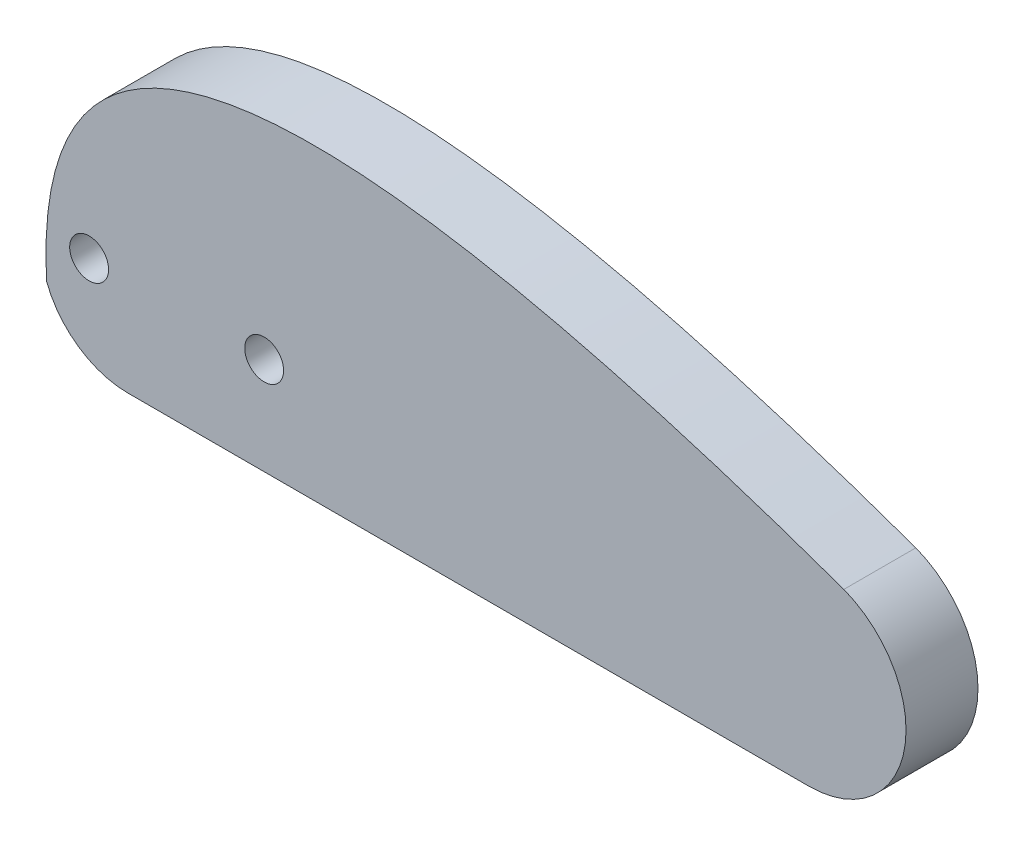
ISO-10303-21;
HEADER;
FILE_DESCRIPTION(('STEP AP214'),'2;1');
FILE_NAME('part.step','',(''),(''),'','','');
FILE_SCHEMA(('AUTOMOTIVE_DESIGN { 1 0 10303 214 1 1 1 1 }'));
ENDSEC;
DATA;
#1=APPLICATION_CONTEXT('core data for automotive mechanical design processes');
#2=APPLICATION_PROTOCOL_DEFINITION('international standard','automotive_design',2000,#1);
#3=PRODUCT_CONTEXT('',#1,'mechanical');
#4=PRODUCT('Part','Part','',(#3));
#5=PRODUCT_RELATED_PRODUCT_CATEGORY('part','',(#4));
#6=PRODUCT_DEFINITION_FORMATION('','',#4);
#7=PRODUCT_DEFINITION_CONTEXT('part definition',#1,'design');
#8=PRODUCT_DEFINITION('design','',#6,#7);
#9=PRODUCT_DEFINITION_SHAPE('','',#8);
#10=(LENGTH_UNIT() NAMED_UNIT(*) SI_UNIT(.MILLI.,.METRE.));
#11=(NAMED_UNIT(*) PLANE_ANGLE_UNIT() SI_UNIT($,.RADIAN.));
#12=(NAMED_UNIT(*) SI_UNIT($,.STERADIAN.) SOLID_ANGLE_UNIT());
#13=UNCERTAINTY_MEASURE_WITH_UNIT(LENGTH_MEASURE(1.E-05),#10,'distance_accuracy_value','');
#14=(GEOMETRIC_REPRESENTATION_CONTEXT(3) GLOBAL_UNCERTAINTY_ASSIGNED_CONTEXT((#13)) GLOBAL_UNIT_ASSIGNED_CONTEXT((#10,
#11,#12)) REPRESENTATION_CONTEXT('',''));
#15=CARTESIAN_POINT('',(0.,0.,0.));
#16=DIRECTION('',(0.,0.,1.));
#17=DIRECTION('',(1.,0.,0.));
#18=AXIS2_PLACEMENT_3D('',#15,#16,#17);
#19=CARTESIAN_POINT('',(0.,-0.516146655197097,3.7));
#20=DIRECTION('',(0.,0.,-1.));
#21=DIRECTION('',(-1.,0.,0.));
#22=AXIS2_PLACEMENT_3D('',#19,#20,#21);
#23=PLANE('',#22);
#24=CARTESIAN_POINT('',(0.,-0.516146655197097,3.7));
#25=DIRECTION('',(0.,0.,1.));
#26=DIRECTION('',(-1.,0.,0.));
#27=AXIS2_PLACEMENT_3D('',#24,#25,#26);
#28=CIRCLE('',#27,4.4838533448029);
#29=CARTESIAN_POINT('',(-4.18289775265634,-2.13117210655156,3.7));
#30=VERTEX_POINT('',#29);
#31=CARTESIAN_POINT('',(0.,-5.,3.7));
#32=VERTEX_POINT('',#31);
#33=EDGE_CURVE('E84',#30,#32,#28,.T.);
#34=ORIENTED_EDGE('',*,*,#33,.T.);
#35=DIRECTION('',(1.,0.,0.));
#36=VECTOR('',#35,1.);
#37=CARTESIAN_POINT('',(0.,-5.,3.7));
#38=LINE('',#37,#36);
#39=CARTESIAN_POINT('',(35.,-5.,3.7));
#40=VERTEX_POINT('',#39);
#41=EDGE_CURVE('E79',#32,#40,#38,.T.);
#42=ORIENTED_EDGE('',*,*,#41,.T.);
#43=CARTESIAN_POINT('',(35.,0.,3.7));
#44=DIRECTION('',(0.,0.,1.));
#45=DIRECTION('',(1.,0.,0.));
#46=AXIS2_PLACEMENT_3D('',#43,#44,#45);
#47=CIRCLE('',#46,5.);
#48=CARTESIAN_POINT('',(36.8028546482242,4.66365898382122,3.7));
#49=VERTEX_POINT('',#48);
#50=EDGE_CURVE('E82',#40,#49,#47,.T.);
#51=ORIENTED_EDGE('',*,*,#50,.T.);
#52=CARTESIAN_POINT('',(36.8028546482242,4.66365898382122,3.7));
#53=CARTESIAN_POINT('',(-5.42252809931158,19.7411868098003,3.7));
#54=CARTESIAN_POINT('',(-4.18289775265634,-2.13117210655156,3.7));
#55=B_SPLINE_CURVE_WITH_KNOTS('',2,(#52,#53,#54),.UNSPECIFIED.,.F.,.F.,(3,3),(0.,1.),.UNSPECIFIED.);
#56=EDGE_CURVE('E49',#49,#30,#55,.T.);
#57=ORIENTED_EDGE('',*,*,#56,.T.);
#58=EDGE_LOOP('',(#34,#42,#51,#57));
#59=FACE_BOUND('',#58,.T.);
#60=CARTESIAN_POINT('',(-2.,0.,3.7));
#61=DIRECTION('',(0.,0.,1.));
#62=DIRECTION('',(1.,0.,0.));
#63=AXIS2_PLACEMENT_3D('',#60,#61,#62);
#64=CIRCLE('',#63,1.);
#65=CARTESIAN_POINT('',(-1.,0.,3.7));
#66=VERTEX_POINT('',#65);
#67=EDGE_CURVE('E144',#66,#66,#64,.T.);
#68=ORIENTED_EDGE('',*,*,#67,.F.);
#69=EDGE_LOOP('',(#68));
#70=FACE_BOUND('',#69,.T.);
#71=CARTESIAN_POINT('',(7.,0.,3.7));
#72=DIRECTION('',(0.,0.,1.));
#73=DIRECTION('',(1.,0.,0.));
#74=AXIS2_PLACEMENT_3D('',#71,#72,#73);
#75=CIRCLE('',#74,1.);
#76=CARTESIAN_POINT('',(8.,0.,3.7));
#77=VERTEX_POINT('',#76);
#78=EDGE_CURVE('E135',#77,#77,#75,.T.);
#79=ORIENTED_EDGE('',*,*,#78,.F.);
#80=EDGE_LOOP('',(#79));
#81=FACE_BOUND('',#80,.T.);
#82=ADVANCED_FACE('F32',(#59,#70,#81),#23,.F.);
#83=CARTESIAN_POINT('',(0.,-0.516146655197097,0.));
#84=DIRECTION('',(0.,0.,-1.));
#85=DIRECTION('',(-1.,0.,0.));
#86=AXIS2_PLACEMENT_3D('',#83,#84,#85);
#87=PLANE('',#86);
#88=CARTESIAN_POINT('',(-2.,0.,0.));
#89=DIRECTION('',(0.,0.,1.));
#90=DIRECTION('',(1.,0.,0.));
#91=AXIS2_PLACEMENT_3D('',#88,#89,#90);
#92=CIRCLE('',#91,1.);
#93=CARTESIAN_POINT('',(-1.,0.,0.));
#94=VERTEX_POINT('',#93);
#95=EDGE_CURVE('E141',#94,#94,#92,.T.);
#96=ORIENTED_EDGE('',*,*,#95,.T.);
#97=EDGE_LOOP('',(#96));
#98=FACE_BOUND('',#97,.T.);
#99=CARTESIAN_POINT('',(0.,-0.516146655197097,0.));
#100=DIRECTION('',(0.,0.,1.));
#101=DIRECTION('',(-1.,0.,0.));
#102=AXIS2_PLACEMENT_3D('',#99,#100,#101);
#103=CIRCLE('',#102,4.4838533448029);
#104=CARTESIAN_POINT('',(-4.18289775265634,-2.13117210655156,0.));
#105=VERTEX_POINT('',#104);
#106=CARTESIAN_POINT('',(0.,-5.,0.));
#107=VERTEX_POINT('',#106);
#108=EDGE_CURVE('E99',#105,#107,#103,.T.);
#109=ORIENTED_EDGE('',*,*,#108,.F.);
#110=CARTESIAN_POINT('',(36.8028546482242,4.66365898382122,0.));
#111=CARTESIAN_POINT('',(-5.42252809931158,19.7411868098003,0.));
#112=CARTESIAN_POINT('',(-4.18289775265634,-2.13117210655156,0.));
#113=B_SPLINE_CURVE_WITH_KNOTS('',2,(#110,#111,#112),.UNSPECIFIED.,.F.,.F.,(3,3),(0.,1.),.UNSPECIFIED.);
#114=CARTESIAN_POINT('',(36.8028546482242,4.66365898382122,0.));
#115=VERTEX_POINT('',#114);
#116=EDGE_CURVE('E72',#115,#105,#113,.T.);
#117=ORIENTED_EDGE('',*,*,#116,.F.);
#118=CARTESIAN_POINT('',(35.,0.,0.));
#119=DIRECTION('',(0.,0.,1.));
#120=DIRECTION('',(1.,0.,0.));
#121=AXIS2_PLACEMENT_3D('',#118,#119,#120);
#122=CIRCLE('',#121,5.);
#123=CARTESIAN_POINT('',(35.,-5.,0.));
#124=VERTEX_POINT('',#123);
#125=EDGE_CURVE('E66',#124,#115,#122,.T.);
#126=ORIENTED_EDGE('',*,*,#125,.F.);
#127=DIRECTION('',(1.,0.,0.));
#128=VECTOR('',#127,1.);
#129=CARTESIAN_POINT('',(0.,-5.,0.));
#130=LINE('',#129,#128);
#131=EDGE_CURVE('E88',#107,#124,#130,.T.);
#132=ORIENTED_EDGE('',*,*,#131,.F.);
#133=EDGE_LOOP('',(#109,#117,#126,#132));
#134=FACE_BOUND('',#133,.T.);
#135=CARTESIAN_POINT('',(7.,0.,0.));
#136=DIRECTION('',(0.,0.,1.));
#137=DIRECTION('',(1.,0.,0.));
#138=AXIS2_PLACEMENT_3D('',#135,#136,#137);
#139=CIRCLE('',#138,1.);
#140=CARTESIAN_POINT('',(8.,0.,0.));
#141=VERTEX_POINT('',#140);
#142=EDGE_CURVE('E138',#141,#141,#139,.T.);
#143=ORIENTED_EDGE('',*,*,#142,.T.);
#144=EDGE_LOOP('',(#143));
#145=FACE_BOUND('',#144,.T.);
#146=ADVANCED_FACE('F110',(#98,#134,#145),#87,.T.);
#147=CARTESIAN_POINT('',(0.,-0.516146655197097,3.7));
#148=DIRECTION('',(0.,0.,-1.));
#149=DIRECTION('',(-1.,0.,0.));
#150=AXIS2_PLACEMENT_3D('',#147,#148,#149);
#151=CYLINDRICAL_SURFACE('',#150,4.4838533448029);
#152=ORIENTED_EDGE('',*,*,#108,.T.);
#153=DIRECTION('',(0.,0.,-1.));
#154=VECTOR('',#153,1.);
#155=CARTESIAN_POINT('',(0.,-5.,3.7));
#156=LINE('',#155,#154);
#157=EDGE_CURVE('E11',#32,#107,#156,.T.);
#158=ORIENTED_EDGE('',*,*,#157,.F.);
#159=ORIENTED_EDGE('',*,*,#33,.F.);
#160=DIRECTION('',(0.,0.,-1.));
#161=VECTOR('',#160,1.);
#162=CARTESIAN_POINT('',(-4.18289775265634,-2.13117210655156,3.7));
#163=LINE('',#162,#161);
#164=EDGE_CURVE('E92',#30,#105,#163,.T.);
#165=ORIENTED_EDGE('',*,*,#164,.T.);
#166=EDGE_LOOP('',(#152,#158,#159,#165));
#167=FACE_BOUND('',#166,.T.);
#168=ADVANCED_FACE('F34',(#167),#151,.T.);
#169=CARTESIAN_POINT('',(0.,-5.,3.7));
#170=DIRECTION('',(0.,1.,0.));
#171=DIRECTION('',(0.,0.,1.));
#172=AXIS2_PLACEMENT_3D('',#169,#170,#171);
#173=PLANE('',#172);
#174=ORIENTED_EDGE('',*,*,#131,.T.);
#175=DIRECTION('',(0.,0.,-1.));
#176=VECTOR('',#175,1.);
#177=CARTESIAN_POINT('',(35.,-5.,3.7));
#178=LINE('',#177,#176);
#179=EDGE_CURVE('E41',#40,#124,#178,.T.);
#180=ORIENTED_EDGE('',*,*,#179,.F.);
#181=ORIENTED_EDGE('',*,*,#41,.F.);
#182=ORIENTED_EDGE('',*,*,#157,.T.);
#183=EDGE_LOOP('',(#174,#180,#181,#182));
#184=FACE_BOUND('',#183,.T.);
#185=ADVANCED_FACE('F87',(#184),#173,.F.);
#186=CARTESIAN_POINT('',(35.,0.,3.7));
#187=DIRECTION('',(0.,0.,-1.));
#188=DIRECTION('',(-1.,0.,0.));
#189=AXIS2_PLACEMENT_3D('',#186,#187,#188);
#190=CYLINDRICAL_SURFACE('',#189,5.);
#191=ORIENTED_EDGE('',*,*,#125,.T.);
#192=DIRECTION('',(0.,0.,-1.));
#193=VECTOR('',#192,1.);
#194=CARTESIAN_POINT('',(36.8028546482242,4.66365898382122,3.7));
#195=LINE('',#194,#193);
#196=EDGE_CURVE('E89',#49,#115,#195,.T.);
#197=ORIENTED_EDGE('',*,*,#196,.F.);
#198=ORIENTED_EDGE('',*,*,#50,.F.);
#199=ORIENTED_EDGE('',*,*,#179,.T.);
#200=EDGE_LOOP('',(#191,#197,#198,#199));
#201=FACE_BOUND('',#200,.T.);
#202=ADVANCED_FACE('F90',(#201),#190,.T.);
#203=DIRECTION('',(0.,0.,-1.));
#204=VECTOR('',#203,1.);
#205=SURFACE_OF_LINEAR_EXTRUSION('',#55,#204);
#206=ORIENTED_EDGE('',*,*,#116,.T.);
#207=ORIENTED_EDGE('',*,*,#164,.F.);
#208=ORIENTED_EDGE('',*,*,#56,.F.);
#209=ORIENTED_EDGE('',*,*,#196,.T.);
#210=EDGE_LOOP('',(#206,#207,#208,#209));
#211=FACE_BOUND('',#210,.T.);
#212=ADVANCED_FACE('F105',(#211),#205,.F.);
#213=CARTESIAN_POINT('',(-2.,0.,3.7));
#214=DIRECTION('',(0.,0.,-1.));
#215=DIRECTION('',(-1.,0.,0.));
#216=AXIS2_PLACEMENT_3D('',#213,#214,#215);
#217=CYLINDRICAL_SURFACE('',#216,1.);
#218=ORIENTED_EDGE('',*,*,#67,.T.);
#219=EDGE_LOOP('',(#218));
#220=FACE_BOUND('',#219,.T.);
#221=ORIENTED_EDGE('',*,*,#95,.F.);
#222=EDGE_LOOP('',(#221));
#223=FACE_BOUND('',#222,.T.);
#224=ADVANCED_FACE('F109',(#220,#223),#217,.F.);
#225=CARTESIAN_POINT('',(7.,0.,3.7));
#226=DIRECTION('',(0.,0.,-1.));
#227=DIRECTION('',(-1.,0.,0.));
#228=AXIS2_PLACEMENT_3D('',#225,#226,#227);
#229=CYLINDRICAL_SURFACE('',#228,1.);
#230=ORIENTED_EDGE('',*,*,#78,.T.);
#231=EDGE_LOOP('',(#230));
#232=FACE_BOUND('',#231,.T.);
#233=ORIENTED_EDGE('',*,*,#142,.F.);
#234=EDGE_LOOP('',(#233));
#235=FACE_BOUND('',#234,.T.);
#236=ADVANCED_FACE('F126',(#232,#235),#229,.F.);
#237=CLOSED_SHELL('',(#82,#146,#168,#185,#202,#212,#224,#236));
#238=MANIFOLD_SOLID_BREP('B2',#237);
#239=ADVANCED_BREP_SHAPE_REPRESENTATION('',(#18,#238),#14);
#240=SHAPE_DEFINITION_REPRESENTATION(#9,#239);
ENDSEC;
END-ISO-10303-21;
